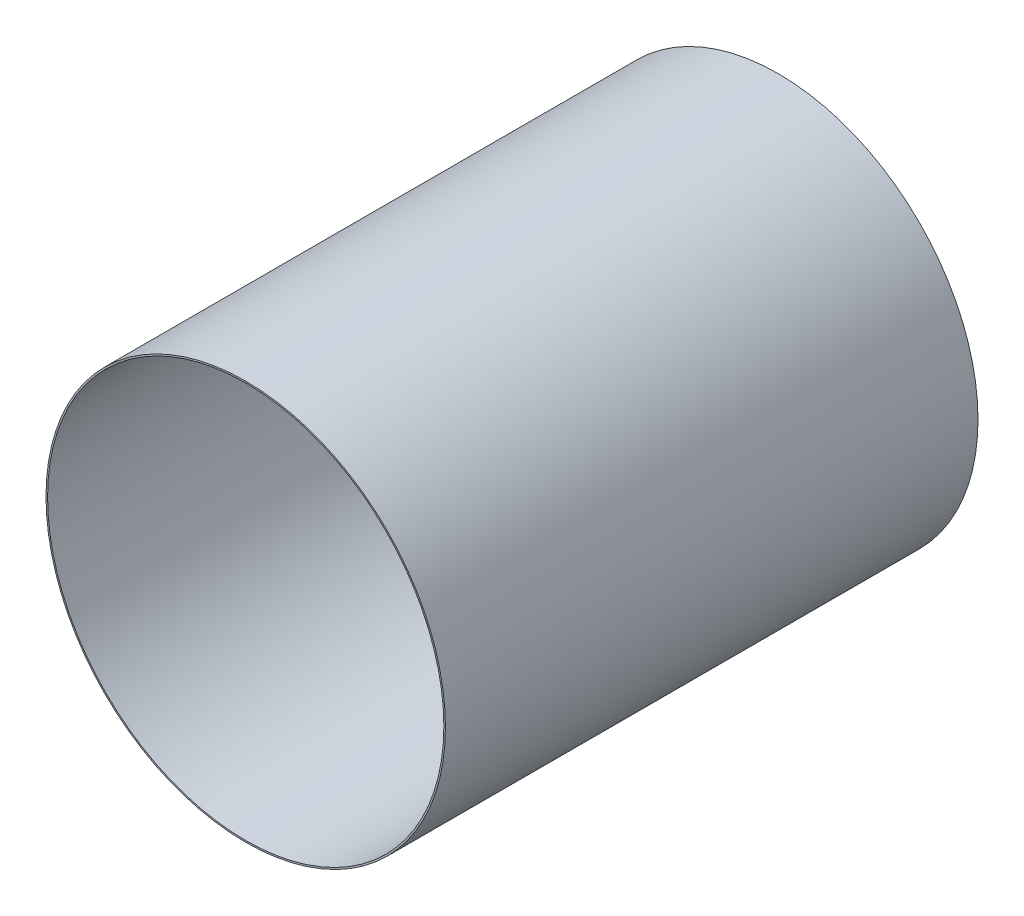
ISO-10303-21;
HEADER;
FILE_DESCRIPTION(('STEP AP214'),'2;1');
FILE_NAME('part.step','',(''),(''),'','','');
FILE_SCHEMA(('AUTOMOTIVE_DESIGN { 1 0 10303 214 1 1 1 1 }'));
ENDSEC;
DATA;
#1=APPLICATION_CONTEXT('core data for automotive mechanical design processes');
#2=APPLICATION_PROTOCOL_DEFINITION('international standard','automotive_design',2000,#1);
#3=PRODUCT_CONTEXT('',#1,'mechanical');
#4=PRODUCT('Part','Part','',(#3));
#5=PRODUCT_RELATED_PRODUCT_CATEGORY('part','',(#4));
#6=PRODUCT_DEFINITION_FORMATION('','',#4);
#7=PRODUCT_DEFINITION_CONTEXT('part definition',#1,'design');
#8=PRODUCT_DEFINITION('design','',#6,#7);
#9=PRODUCT_DEFINITION_SHAPE('','',#8);
#10=(LENGTH_UNIT() NAMED_UNIT(*) SI_UNIT(.MILLI.,.METRE.));
#11=(NAMED_UNIT(*) PLANE_ANGLE_UNIT() SI_UNIT($,.RADIAN.));
#12=(NAMED_UNIT(*) SI_UNIT($,.STERADIAN.) SOLID_ANGLE_UNIT());
#13=UNCERTAINTY_MEASURE_WITH_UNIT(LENGTH_MEASURE(1.E-05),#10,'distance_accuracy_value','');
#14=(GEOMETRIC_REPRESENTATION_CONTEXT(3) GLOBAL_UNCERTAINTY_ASSIGNED_CONTEXT((#13)) GLOBAL_UNIT_ASSIGNED_CONTEXT((#10,
#11,#12)) REPRESENTATION_CONTEXT('',''));
#15=CARTESIAN_POINT('',(0.,0.,0.));
#16=DIRECTION('',(0.,0.,1.));
#17=DIRECTION('',(1.,0.,0.));
#18=AXIS2_PLACEMENT_3D('',#15,#16,#17);
#19=CARTESIAN_POINT('',(0.,0.,101.6));
#20=DIRECTION('',(0.,0.,-1.));
#21=DIRECTION('',(-1.,0.,0.));
#22=AXIS2_PLACEMENT_3D('',#19,#20,#21);
#23=CYLINDRICAL_SURFACE('',#22,38.1);
#24=CARTESIAN_POINT('',(0.,0.,101.6));
#25=DIRECTION('',(0.,0.,1.));
#26=DIRECTION('',(1.,0.,0.));
#27=AXIS2_PLACEMENT_3D('',#24,#25,#26);
#28=CIRCLE('',#27,38.1);
#29=CARTESIAN_POINT('',(38.1,0.,101.6));
#30=VERTEX_POINT('',#29);
#31=EDGE_CURVE('E10',#30,#30,#28,.T.);
#32=ORIENTED_EDGE('',*,*,#31,.F.);
#33=EDGE_LOOP('',(#32));
#34=FACE_BOUND('',#33,.T.);
#35=CARTESIAN_POINT('',(0.,0.,0.));
#36=DIRECTION('',(0.,0.,1.));
#37=DIRECTION('',(1.,0.,0.));
#38=AXIS2_PLACEMENT_3D('',#35,#36,#37);
#39=CIRCLE('',#38,38.1);
#40=CARTESIAN_POINT('',(38.1,0.,0.));
#41=VERTEX_POINT('',#40);
#42=EDGE_CURVE('E34',#41,#41,#39,.T.);
#43=ORIENTED_EDGE('',*,*,#42,.T.);
#44=EDGE_LOOP('',(#43));
#45=FACE_BOUND('',#44,.T.);
#46=ADVANCED_FACE('F31',(#34,#45),#23,.T.);
#47=CARTESIAN_POINT('',(0.,0.,101.6));
#48=DIRECTION('',(0.,0.,1.));
#49=DIRECTION('',(1.,0.,0.));
#50=AXIS2_PLACEMENT_3D('',#47,#48,#49);
#51=PLANE('',#50);
#52=CARTESIAN_POINT('',(0.,0.,101.6));
#53=DIRECTION('',(0.,0.,1.));
#54=DIRECTION('',(1.,0.,0.));
#55=AXIS2_PLACEMENT_3D('',#52,#53,#54);
#56=CIRCLE('',#55,37.8);
#57=CARTESIAN_POINT('',(37.8,0.,101.6));
#58=VERTEX_POINT('',#57);
#59=EDGE_CURVE('E41',#58,#58,#56,.T.);
#60=ORIENTED_EDGE('',*,*,#59,.F.);
#61=EDGE_LOOP('',(#60));
#62=FACE_BOUND('',#61,.T.);
#63=ORIENTED_EDGE('',*,*,#31,.T.);
#64=EDGE_LOOP('',(#63));
#65=FACE_BOUND('',#64,.T.);
#66=ADVANCED_FACE('F62',(#62,#65),#51,.T.);
#67=CARTESIAN_POINT('',(0.,0.,0.));
#68=DIRECTION('',(0.,0.,1.));
#69=DIRECTION('',(1.,0.,0.));
#70=AXIS2_PLACEMENT_3D('',#67,#68,#69);
#71=PLANE('',#70);
#72=ORIENTED_EDGE('',*,*,#42,.F.);
#73=EDGE_LOOP('',(#72));
#74=FACE_BOUND('',#73,.T.);
#75=ADVANCED_FACE('F53',(#74),#71,.F.);
#76=CARTESIAN_POINT('',(0.,0.,101.6));
#77=DIRECTION('',(0.,0.,-1.));
#78=DIRECTION('',(-1.,0.,0.));
#79=AXIS2_PLACEMENT_3D('',#76,#77,#78);
#80=CYLINDRICAL_SURFACE('',#79,37.8);
#81=ORIENTED_EDGE('',*,*,#59,.T.);
#82=EDGE_LOOP('',(#81));
#83=FACE_BOUND('',#82,.T.);
#84=CARTESIAN_POINT('',(0.,0.,0.299999999999995));
#85=DIRECTION('',(0.,0.,1.));
#86=DIRECTION('',(1.,0.,0.));
#87=AXIS2_PLACEMENT_3D('',#84,#85,#86);
#88=CIRCLE('',#87,37.8);
#89=CARTESIAN_POINT('',(37.8,0.,0.299999999999995));
#90=VERTEX_POINT('',#89);
#91=EDGE_CURVE('E45',#90,#90,#88,.T.);
#92=ORIENTED_EDGE('',*,*,#91,.F.);
#93=EDGE_LOOP('',(#92));
#94=FACE_BOUND('',#93,.T.);
#95=ADVANCED_FACE('F51',(#83,#94),#80,.F.);
#96=CARTESIAN_POINT('',(0.,0.,0.3));
#97=DIRECTION('',(0.,0.,1.));
#98=DIRECTION('',(1.,0.,0.));
#99=AXIS2_PLACEMENT_3D('',#96,#97,#98);
#100=PLANE('',#99);
#101=ORIENTED_EDGE('',*,*,#91,.T.);
#102=EDGE_LOOP('',(#101));
#103=FACE_BOUND('',#102,.T.);
#104=ADVANCED_FACE('F49',(#103),#100,.T.);
#105=CLOSED_SHELL('',(#46,#66,#75,#95,#104));
#106=MANIFOLD_SOLID_BREP('B2',#105);
#107=ADVANCED_BREP_SHAPE_REPRESENTATION('',(#18,#106),#14);
#108=SHAPE_DEFINITION_REPRESENTATION(#9,#107);
ENDSEC;
END-ISO-10303-21;
